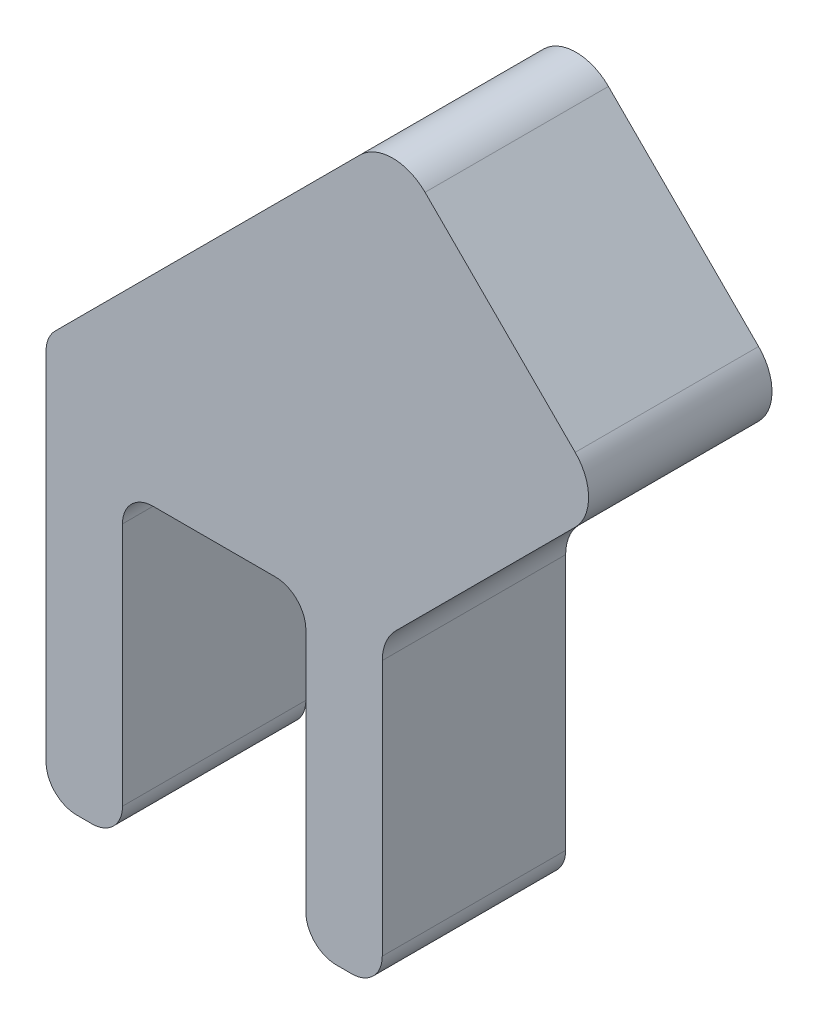
ISO-10303-21;
HEADER;
FILE_DESCRIPTION(('STEP AP214'),'2;1');
FILE_NAME('part.step','',(''),(''),'','','');
FILE_SCHEMA(('AUTOMOTIVE_DESIGN { 1 0 10303 214 1 1 1 1 }'));
ENDSEC;
DATA;
#1=APPLICATION_CONTEXT('core data for automotive mechanical design processes');
#2=APPLICATION_PROTOCOL_DEFINITION('international standard','automotive_design',2000,#1);
#3=PRODUCT_CONTEXT('',#1,'mechanical');
#4=PRODUCT('Part','Part','',(#3));
#5=PRODUCT_RELATED_PRODUCT_CATEGORY('part','',(#4));
#6=PRODUCT_DEFINITION_FORMATION('','',#4);
#7=PRODUCT_DEFINITION_CONTEXT('part definition',#1,'design');
#8=PRODUCT_DEFINITION('design','',#6,#7);
#9=PRODUCT_DEFINITION_SHAPE('','',#8);
#10=(LENGTH_UNIT() NAMED_UNIT(*) SI_UNIT(.MILLI.,.METRE.));
#11=(NAMED_UNIT(*) PLANE_ANGLE_UNIT() SI_UNIT($,.RADIAN.));
#12=(NAMED_UNIT(*) SI_UNIT($,.STERADIAN.) SOLID_ANGLE_UNIT());
#13=UNCERTAINTY_MEASURE_WITH_UNIT(LENGTH_MEASURE(1.E-05),#10,'distance_accuracy_value','');
#14=(GEOMETRIC_REPRESENTATION_CONTEXT(3) GLOBAL_UNCERTAINTY_ASSIGNED_CONTEXT((#13)) GLOBAL_UNIT_ASSIGNED_CONTEXT((#10,
#11,#12)) REPRESENTATION_CONTEXT('',''));
#15=CARTESIAN_POINT('',(0.,0.,0.));
#16=DIRECTION('',(0.,0.,1.));
#17=DIRECTION('',(1.,0.,0.));
#18=AXIS2_PLACEMENT_3D('',#15,#16,#17);
#19=CARTESIAN_POINT('',(0.,0.,12.));
#20=DIRECTION('',(1.,0.,0.));
#21=DIRECTION('',(0.,0.,-1.));
#22=AXIS2_PLACEMENT_3D('',#19,#20,#21);
#23=PLANE('',#22);
#24=DIRECTION('',(0.,-1.,0.));
#25=VECTOR('',#24,1.);
#26=CARTESIAN_POINT('',(0.,0.,12.));
#27=LINE('',#26,#25);
#28=CARTESIAN_POINT('',(0.,25.3071660955928,12.));
#29=VERTEX_POINT('',#28);
#30=CARTESIAN_POINT('',(0.,2.,12.));
#31=VERTEX_POINT('',#30);
#32=EDGE_CURVE('E238',#29,#31,#27,.T.);
#33=ORIENTED_EDGE('',*,*,#32,.F.);
#34=DIRECTION('',(0.,0.,-1.));
#35=VECTOR('',#34,1.);
#36=CARTESIAN_POINT('',(0.,25.3071660955928,12.));
#37=LINE('',#36,#35);
#38=CARTESIAN_POINT('',(0.,25.3071660955928,0.));
#39=VERTEX_POINT('',#38);
#40=EDGE_CURVE('E252',#29,#39,#37,.T.);
#41=ORIENTED_EDGE('',*,*,#40,.T.);
#42=DIRECTION('',(0.,-1.,0.));
#43=VECTOR('',#42,1.);
#44=CARTESIAN_POINT('',(0.,0.,0.));
#45=LINE('',#44,#43);
#46=CARTESIAN_POINT('',(0.,2.,0.));
#47=VERTEX_POINT('',#46);
#48=EDGE_CURVE('E207',#39,#47,#45,.T.);
#49=ORIENTED_EDGE('',*,*,#48,.T.);
#50=DIRECTION('',(0.,0.,-1.));
#51=VECTOR('',#50,1.);
#52=CARTESIAN_POINT('',(0.,2.,12.));
#53=LINE('',#52,#51);
#54=EDGE_CURVE('E187',#47,#31,#53,.F.);
#55=ORIENTED_EDGE('',*,*,#54,.T.);
#56=EDGE_LOOP('',(#33,#41,#49,#55));
#57=FACE_BOUND('',#56,.T.);
#58=ADVANCED_FACE('F33',(#57),#23,.F.);
#59=CARTESIAN_POINT('',(0.,0.,12.));
#60=DIRECTION('',(0.,1.,0.));
#61=DIRECTION('',(0.,0.,1.));
#62=AXIS2_PLACEMENT_3D('',#59,#60,#61);
#63=PLANE('',#62);
#64=DIRECTION('',(1.,0.,0.));
#65=VECTOR('',#64,1.);
#66=CARTESIAN_POINT('',(0.,0.,12.));
#67=LINE('',#66,#65);
#68=CARTESIAN_POINT('',(2.,0.,12.));
#69=VERTEX_POINT('',#68);
#70=CARTESIAN_POINT('',(3.,0.,12.));
#71=VERTEX_POINT('',#70);
#72=EDGE_CURVE('E333',#69,#71,#67,.T.);
#73=ORIENTED_EDGE('',*,*,#72,.F.);
#74=DIRECTION('',(0.,0.,-1.));
#75=VECTOR('',#74,1.);
#76=CARTESIAN_POINT('',(2.,0.,12.));
#77=LINE('',#76,#75);
#78=CARTESIAN_POINT('',(2.,0.,0.));
#79=VERTEX_POINT('',#78);
#80=EDGE_CURVE('E278',#69,#79,#77,.T.);
#81=ORIENTED_EDGE('',*,*,#80,.T.);
#82=DIRECTION('',(1.,0.,0.));
#83=VECTOR('',#82,1.);
#84=CARTESIAN_POINT('',(0.,0.,0.));
#85=LINE('',#84,#83);
#86=CARTESIAN_POINT('',(3.,0.,0.));
#87=VERTEX_POINT('',#86);
#88=EDGE_CURVE('E210',#79,#87,#85,.T.);
#89=ORIENTED_EDGE('',*,*,#88,.T.);
#90=DIRECTION('',(0.,0.,-1.));
#91=VECTOR('',#90,1.);
#92=CARTESIAN_POINT('',(3.,0.,12.));
#93=LINE('',#92,#91);
#94=EDGE_CURVE('E276',#87,#71,#93,.F.);
#95=ORIENTED_EDGE('',*,*,#94,.T.);
#96=EDGE_LOOP('',(#73,#81,#89,#95));
#97=FACE_BOUND('',#96,.T.);
#98=ADVANCED_FACE('F349',(#97),#63,.F.);
#99=CARTESIAN_POINT('',(5.,0.,12.));
#100=DIRECTION('',(-1.,0.,0.));
#101=DIRECTION('',(0.,0.,1.));
#102=AXIS2_PLACEMENT_3D('',#99,#100,#101);
#103=PLANE('',#102);
#104=DIRECTION('',(0.,1.,0.));
#105=VECTOR('',#104,1.);
#106=CARTESIAN_POINT('',(5.,0.,12.));
#107=LINE('',#106,#105);
#108=CARTESIAN_POINT('',(5.,2.,12.));
#109=VERTEX_POINT('',#108);
#110=CARTESIAN_POINT('',(5.,18.,12.));
#111=VERTEX_POINT('',#110);
#112=EDGE_CURVE('E328',#109,#111,#107,.T.);
#113=ORIENTED_EDGE('',*,*,#112,.F.);
#114=DIRECTION('',(0.,0.,-1.));
#115=VECTOR('',#114,1.);
#116=CARTESIAN_POINT('',(5.,2.,12.));
#117=LINE('',#116,#115);
#118=CARTESIAN_POINT('',(5.,2.,0.));
#119=VERTEX_POINT('',#118);
#120=EDGE_CURVE('E283',#109,#119,#117,.T.);
#121=ORIENTED_EDGE('',*,*,#120,.T.);
#122=DIRECTION('',(0.,1.,0.));
#123=VECTOR('',#122,1.);
#124=CARTESIAN_POINT('',(5.,0.,0.));
#125=LINE('',#124,#123);
#126=CARTESIAN_POINT('',(5.,18.,0.));
#127=VERTEX_POINT('',#126);
#128=EDGE_CURVE('E213',#119,#127,#125,.T.);
#129=ORIENTED_EDGE('',*,*,#128,.T.);
#130=DIRECTION('',(0.,0.,-1.));
#131=VECTOR('',#130,1.);
#132=CARTESIAN_POINT('',(5.,18.,12.));
#133=LINE('',#132,#131);
#134=EDGE_CURVE('E281',#127,#111,#133,.F.);
#135=ORIENTED_EDGE('',*,*,#134,.T.);
#136=EDGE_LOOP('',(#113,#121,#129,#135));
#137=FACE_BOUND('',#136,.T.);
#138=ADVANCED_FACE('F358',(#137),#103,.F.);
#139=CARTESIAN_POINT('',(5.,20.,12.));
#140=DIRECTION('',(0.,1.,0.));
#141=DIRECTION('',(0.,0.,1.));
#142=AXIS2_PLACEMENT_3D('',#139,#140,#141);
#143=PLANE('',#142);
#144=DIRECTION('',(1.,0.,0.));
#145=VECTOR('',#144,1.);
#146=CARTESIAN_POINT('',(5.,20.,12.));
#147=LINE('',#146,#145);
#148=CARTESIAN_POINT('',(7.,20.,12.));
#149=VERTEX_POINT('',#148);
#150=CARTESIAN_POINT('',(15.,20.,12.));
#151=VERTEX_POINT('',#150);
#152=EDGE_CURVE('E323',#149,#151,#147,.T.);
#153=ORIENTED_EDGE('',*,*,#152,.F.);
#154=DIRECTION('',(0.,0.,-1.));
#155=VECTOR('',#154,1.);
#156=CARTESIAN_POINT('',(7.,20.,0.));
#157=LINE('',#156,#155);
#158=CARTESIAN_POINT('',(7.,20.,0.));
#159=VERTEX_POINT('',#158);
#160=EDGE_CURVE('E299',#149,#159,#157,.T.);
#161=ORIENTED_EDGE('',*,*,#160,.T.);
#162=DIRECTION('',(1.,0.,0.));
#163=VECTOR('',#162,1.);
#164=CARTESIAN_POINT('',(5.,20.,0.));
#165=LINE('',#164,#163);
#166=CARTESIAN_POINT('',(15.,20.,0.));
#167=VERTEX_POINT('',#166);
#168=EDGE_CURVE('E216',#159,#167,#165,.T.);
#169=ORIENTED_EDGE('',*,*,#168,.T.);
#170=DIRECTION('',(0.,0.,-1.));
#171=VECTOR('',#170,1.);
#172=CARTESIAN_POINT('',(15.,20.,12.));
#173=LINE('',#172,#171);
#174=EDGE_CURVE('E297',#167,#151,#173,.F.);
#175=ORIENTED_EDGE('',*,*,#174,.T.);
#176=EDGE_LOOP('',(#153,#161,#169,#175));
#177=FACE_BOUND('',#176,.T.);
#178=ADVANCED_FACE('F315',(#177),#143,.F.);
#179=CARTESIAN_POINT('',(17.,20.,12.));
#180=DIRECTION('',(1.,0.,0.));
#181=DIRECTION('',(0.,1.,0.));
#182=AXIS2_PLACEMENT_3D('',#179,#180,#181);
#183=PLANE('',#182);
#184=DIRECTION('',(0.,-1.,0.));
#185=VECTOR('',#184,1.);
#186=CARTESIAN_POINT('',(17.,20.,0.));
#187=LINE('',#186,#185);
#188=CARTESIAN_POINT('',(17.,18.,0.));
#189=VERTEX_POINT('',#188);
#190=CARTESIAN_POINT('',(17.,2.,0.));
#191=VERTEX_POINT('',#190);
#192=EDGE_CURVE('E219',#189,#191,#187,.T.);
#193=ORIENTED_EDGE('',*,*,#192,.T.);
#194=DIRECTION('',(0.,0.,-1.));
#195=VECTOR('',#194,1.);
#196=CARTESIAN_POINT('',(17.,2.,12.));
#197=LINE('',#196,#195);
#198=CARTESIAN_POINT('',(17.,2.,12.));
#199=VERTEX_POINT('',#198);
#200=EDGE_CURVE('E293',#191,#199,#197,.F.);
#201=ORIENTED_EDGE('',*,*,#200,.T.);
#202=DIRECTION('',(0.,-1.,0.));
#203=VECTOR('',#202,1.);
#204=CARTESIAN_POINT('',(17.,20.,12.));
#205=LINE('',#204,#203);
#206=CARTESIAN_POINT('',(17.,18.,12.));
#207=VERTEX_POINT('',#206);
#208=EDGE_CURVE('E321',#207,#199,#205,.T.);
#209=ORIENTED_EDGE('',*,*,#208,.F.);
#210=DIRECTION('',(0.,0.,-1.));
#211=VECTOR('',#210,1.);
#212=CARTESIAN_POINT('',(17.,18.,0.));
#213=LINE('',#212,#211);
#214=EDGE_CURVE('E290',#207,#189,#213,.T.);
#215=ORIENTED_EDGE('',*,*,#214,.T.);
#216=EDGE_LOOP('',(#193,#201,#209,#215));
#217=FACE_BOUND('',#216,.T.);
#218=ADVANCED_FACE('F325',(#217),#183,.F.);
#219=CARTESIAN_POINT('',(17.,0.,12.));
#220=DIRECTION('',(0.,1.,0.));
#221=DIRECTION('',(0.,0.,1.));
#222=AXIS2_PLACEMENT_3D('',#219,#220,#221);
#223=PLANE('',#222);
#224=DIRECTION('',(1.,0.,0.));
#225=VECTOR('',#224,1.);
#226=CARTESIAN_POINT('',(17.,0.,12.));
#227=LINE('',#226,#225);
#228=CARTESIAN_POINT('',(19.,0.,12.));
#229=VERTEX_POINT('',#228);
#230=CARTESIAN_POINT('',(20.,0.,12.));
#231=VERTEX_POINT('',#230);
#232=EDGE_CURVE('E178',#229,#231,#227,.T.);
#233=ORIENTED_EDGE('',*,*,#232,.F.);
#234=DIRECTION('',(0.,0.,-1.));
#235=VECTOR('',#234,1.);
#236=CARTESIAN_POINT('',(19.,0.,12.));
#237=LINE('',#236,#235);
#238=CARTESIAN_POINT('',(19.,0.,0.));
#239=VERTEX_POINT('',#238);
#240=EDGE_CURVE('E287',#229,#239,#237,.T.);
#241=ORIENTED_EDGE('',*,*,#240,.T.);
#242=DIRECTION('',(1.,0.,0.));
#243=VECTOR('',#242,1.);
#244=CARTESIAN_POINT('',(17.,0.,0.));
#245=LINE('',#244,#243);
#246=CARTESIAN_POINT('',(20.,0.,0.));
#247=VERTEX_POINT('',#246);
#248=EDGE_CURVE('E222',#239,#247,#245,.T.);
#249=ORIENTED_EDGE('',*,*,#248,.T.);
#250=DIRECTION('',(0.,0.,-1.));
#251=VECTOR('',#250,1.);
#252=CARTESIAN_POINT('',(20.,0.,12.));
#253=LINE('',#252,#251);
#254=EDGE_CURVE('E56',#247,#231,#253,.F.);
#255=ORIENTED_EDGE('',*,*,#254,.T.);
#256=EDGE_LOOP('',(#233,#241,#249,#255));
#257=FACE_BOUND('',#256,.T.);
#258=ADVANCED_FACE('F393',(#257),#223,.F.);
#259=CARTESIAN_POINT('',(22.,0.,12.));
#260=DIRECTION('',(-1.,0.,0.));
#261=DIRECTION('',(0.,0.,1.));
#262=AXIS2_PLACEMENT_3D('',#259,#260,#261);
#263=PLANE('',#262);
#264=DIRECTION('',(0.,1.,0.));
#265=VECTOR('',#264,1.);
#266=CARTESIAN_POINT('',(22.,0.,12.));
#267=LINE('',#266,#265);
#268=CARTESIAN_POINT('',(22.,2.,12.));
#269=VERTEX_POINT('',#268);
#270=CARTESIAN_POINT('',(22.,18.7573593128807,12.));
#271=VERTEX_POINT('',#270);
#272=EDGE_CURVE('E168',#269,#271,#267,.T.);
#273=ORIENTED_EDGE('',*,*,#272,.F.);
#274=DIRECTION('',(0.,0.,-1.));
#275=VECTOR('',#274,1.);
#276=CARTESIAN_POINT('',(22.,2.,12.));
#277=LINE('',#276,#275);
#278=CARTESIAN_POINT('',(22.,2.,0.));
#279=VERTEX_POINT('',#278);
#280=EDGE_CURVE('E295',#269,#279,#277,.T.);
#281=ORIENTED_EDGE('',*,*,#280,.T.);
#282=DIRECTION('',(0.,1.,0.));
#283=VECTOR('',#282,1.);
#284=CARTESIAN_POINT('',(22.,0.,0.));
#285=LINE('',#284,#283);
#286=CARTESIAN_POINT('',(22.,18.7573593128807,0.));
#287=VERTEX_POINT('',#286);
#288=EDGE_CURVE('E184',#279,#287,#285,.T.);
#289=ORIENTED_EDGE('',*,*,#288,.T.);
#290=DIRECTION('',(0.,0.,-1.));
#291=VECTOR('',#290,1.);
#292=CARTESIAN_POINT('',(22.,18.7573593128807,12.));
#293=LINE('',#292,#291);
#294=EDGE_CURVE('E181',#271,#287,#293,.T.);
#295=ORIENTED_EDGE('',*,*,#294,.F.);
#296=EDGE_LOOP('',(#273,#281,#289,#295));
#297=FACE_BOUND('',#296,.T.);
#298=ADVANCED_FACE('F182',(#297),#263,.F.);
#299=CARTESIAN_POINT('',(25.,18.7573593128807,12.));
#300=DIRECTION('',(0.,0.,-1.));
#301=DIRECTION('',(-1.,0.,0.));
#302=AXIS2_PLACEMENT_3D('',#299,#300,#301);
#303=CYLINDRICAL_SURFACE('',#302,3.);
#304=CARTESIAN_POINT('',(25.,18.7573593128807,0.));
#305=DIRECTION('',(0.,0.,-1.));
#306=DIRECTION('',(-1.,0.,0.));
#307=AXIS2_PLACEMENT_3D('',#304,#305,#306);
#308=CIRCLE('',#307,3.);
#309=CARTESIAN_POINT('',(22.8786796564404,20.8786796564404,0.));
#310=VERTEX_POINT('',#309);
#311=EDGE_CURVE('E225',#287,#310,#308,.T.);
#312=ORIENTED_EDGE('',*,*,#311,.T.);
#313=DIRECTION('',(0.,0.,-1.));
#314=VECTOR('',#313,1.);
#315=CARTESIAN_POINT('',(22.8786796564404,20.8786796564404,12.));
#316=LINE('',#315,#314);
#317=CARTESIAN_POINT('',(22.8786796564404,20.8786796564404,12.));
#318=VERTEX_POINT('',#317);
#319=EDGE_CURVE('E188',#318,#310,#316,.T.);
#320=ORIENTED_EDGE('',*,*,#319,.F.);
#321=CARTESIAN_POINT('',(25.,18.7573593128807,12.));
#322=DIRECTION('',(0.,0.,-1.));
#323=DIRECTION('',(-1.,0.,0.));
#324=AXIS2_PLACEMENT_3D('',#321,#322,#323);
#325=CIRCLE('',#324,3.);
#326=EDGE_CURVE('E173',#271,#318,#325,.T.);
#327=ORIENTED_EDGE('',*,*,#326,.F.);
#328=ORIENTED_EDGE('',*,*,#294,.T.);
#329=EDGE_LOOP('',(#312,#320,#327,#328));
#330=FACE_BOUND('',#329,.T.);
#331=ADVANCED_FACE('F190',(#330),#303,.F.);
#332=CARTESIAN_POINT('',(22.8786796564404,20.8786796564404,12.));
#333=DIRECTION('',(-0.707106781186549,0.707106781186546,0.));
#334=DIRECTION('',(-0.707106781186546,-0.707106781186549,0.));
#335=AXIS2_PLACEMENT_3D('',#332,#333,#334);
#336=PLANE('',#335);
#337=DIRECTION('',(0.707106781186546,0.707106781186549,0.));
#338=VECTOR('',#337,1.);
#339=CARTESIAN_POINT('',(22.8786796564404,20.8786796564404,0.));
#340=LINE('',#339,#338);
#341=CARTESIAN_POINT('',(34.6244423683047,32.6244423683047,0.));
#342=VERTEX_POINT('',#341);
#343=EDGE_CURVE('E227',#310,#342,#340,.T.);
#344=ORIENTED_EDGE('',*,*,#343,.T.);
#345=DIRECTION('',(0.,0.,-1.));
#346=VECTOR('',#345,1.);
#347=CARTESIAN_POINT('',(34.6244423683047,32.6244423683047,12.));
#348=LINE('',#347,#346);
#349=CARTESIAN_POINT('',(34.6244423683047,32.6244423683047,12.));
#350=VERTEX_POINT('',#349);
#351=EDGE_CURVE('E247',#350,#342,#348,.T.);
#352=ORIENTED_EDGE('',*,*,#351,.F.);
#353=DIRECTION('',(0.707106781186546,0.707106781186549,0.));
#354=VECTOR('',#353,1.);
#355=CARTESIAN_POINT('',(22.8786796564404,20.8786796564404,12.));
#356=LINE('',#355,#354);
#357=EDGE_CURVE('E193',#318,#350,#356,.T.);
#358=ORIENTED_EDGE('',*,*,#357,.F.);
#359=ORIENTED_EDGE('',*,*,#319,.T.);
#360=EDGE_LOOP('',(#344,#352,#358,#359));
#361=FACE_BOUND('',#360,.T.);
#362=ADVANCED_FACE('F398',(#361),#336,.F.);
#363=CARTESIAN_POINT('',(32.5031220247451,34.7457627118644,12.));
#364=DIRECTION('',(0.,0.,-1.));
#365=DIRECTION('',(-1.,0.,0.));
#366=AXIS2_PLACEMENT_3D('',#363,#364,#365);
#367=CYLINDRICAL_SURFACE('',#366,3.);
#368=CARTESIAN_POINT('',(32.5031220247451,34.7457627118644,0.));
#369=DIRECTION('',(0.,0.,1.));
#370=DIRECTION('',(1.,0.,0.));
#371=AXIS2_PLACEMENT_3D('',#368,#369,#370);
#372=CIRCLE('',#371,3.);
#373=CARTESIAN_POINT('',(34.6244423683047,36.8670830554241,0.));
#374=VERTEX_POINT('',#373);
#375=EDGE_CURVE('E229',#342,#374,#372,.T.);
#376=ORIENTED_EDGE('',*,*,#375,.T.);
#377=DIRECTION('',(0.,0.,-1.));
#378=VECTOR('',#377,1.);
#379=CARTESIAN_POINT('',(34.6244423683047,36.8670830554241,12.));
#380=LINE('',#379,#378);
#381=CARTESIAN_POINT('',(34.6244423683047,36.8670830554241,12.));
#382=VERTEX_POINT('',#381);
#383=EDGE_CURVE('E244',#382,#374,#380,.T.);
#384=ORIENTED_EDGE('',*,*,#383,.F.);
#385=CARTESIAN_POINT('',(32.5031220247451,34.7457627118644,12.));
#386=DIRECTION('',(0.,0.,1.));
#387=DIRECTION('',(1.,0.,0.));
#388=AXIS2_PLACEMENT_3D('',#385,#386,#387);
#389=CIRCLE('',#388,3.);
#390=EDGE_CURVE('E195',#350,#382,#389,.T.);
#391=ORIENTED_EDGE('',*,*,#390,.F.);
#392=ORIENTED_EDGE('',*,*,#351,.T.);
#393=EDGE_LOOP('',(#376,#384,#391,#392));
#394=FACE_BOUND('',#393,.T.);
#395=ADVANCED_FACE('F405',(#394),#367,.T.);
#396=CARTESIAN_POINT('',(34.6244423683047,36.8670830554241,12.));
#397=DIRECTION('',(-0.707106781186546,-0.707106781186548,0.));
#398=DIRECTION('',(0.707106781186549,-0.707106781186547,0.));
#399=AXIS2_PLACEMENT_3D('',#396,#397,#398);
#400=PLANE('',#399);
#401=DIRECTION('',(-0.707106781186549,0.707106781186547,0.));
#402=VECTOR('',#401,1.);
#403=CARTESIAN_POINT('',(34.6244423683047,36.8670830554241,0.));
#404=LINE('',#403,#402);
#405=CARTESIAN_POINT('',(24.7992864452545,46.6922389784743,0.));
#406=VERTEX_POINT('',#405);
#407=EDGE_CURVE('E231',#374,#406,#404,.T.);
#408=ORIENTED_EDGE('',*,*,#407,.T.);
#409=DIRECTION('',(0.,0.,-1.));
#410=VECTOR('',#409,1.);
#411=CARTESIAN_POINT('',(24.7992864452545,46.6922389784743,12.));
#412=LINE('',#411,#410);
#413=CARTESIAN_POINT('',(24.7992864452545,46.6922389784743,12.));
#414=VERTEX_POINT('',#413);
#415=EDGE_CURVE('E241',#414,#406,#412,.T.);
#416=ORIENTED_EDGE('',*,*,#415,.F.);
#417=DIRECTION('',(-0.707106781186549,0.707106781186547,0.));
#418=VECTOR('',#417,1.);
#419=CARTESIAN_POINT('',(34.6244423683047,36.8670830554241,12.));
#420=LINE('',#419,#418);
#421=EDGE_CURVE('E200',#382,#414,#420,.T.);
#422=ORIENTED_EDGE('',*,*,#421,.F.);
#423=ORIENTED_EDGE('',*,*,#383,.T.);
#424=EDGE_LOOP('',(#408,#416,#422,#423));
#425=FACE_BOUND('',#424,.T.);
#426=ADVANCED_FACE('F408',(#425),#400,.F.);
#427=CARTESIAN_POINT('',(22.6779661016948,44.5709186349146,12.));
#428=DIRECTION('',(0.,0.,-1.));
#429=DIRECTION('',(-1.,0.,0.));
#430=AXIS2_PLACEMENT_3D('',#427,#428,#429);
#431=CYLINDRICAL_SURFACE('',#430,3.);
#432=CARTESIAN_POINT('',(22.6779661016948,44.5709186349146,0.));
#433=DIRECTION('',(0.,0.,1.));
#434=DIRECTION('',(1.,0.,0.));
#435=AXIS2_PLACEMENT_3D('',#432,#433,#434);
#436=CIRCLE('',#435,3.);
#437=CARTESIAN_POINT('',(20.5566457581352,46.6922389784742,0.));
#438=VERTEX_POINT('',#437);
#439=EDGE_CURVE('E233',#406,#438,#436,.T.);
#440=ORIENTED_EDGE('',*,*,#439,.T.);
#441=DIRECTION('',(0.,0.,-1.));
#442=VECTOR('',#441,1.);
#443=CARTESIAN_POINT('',(20.5566457581352,46.6922389784742,12.));
#444=LINE('',#443,#442);
#445=CARTESIAN_POINT('',(20.5566457581352,46.6922389784742,12.));
#446=VERTEX_POINT('',#445);
#447=EDGE_CURVE('E206',#446,#438,#444,.T.);
#448=ORIENTED_EDGE('',*,*,#447,.F.);
#449=CARTESIAN_POINT('',(22.6779661016948,44.5709186349146,12.));
#450=DIRECTION('',(0.,0.,1.));
#451=DIRECTION('',(1.,0.,0.));
#452=AXIS2_PLACEMENT_3D('',#449,#450,#451);
#453=CIRCLE('',#452,3.);
#454=EDGE_CURVE('E202',#414,#446,#453,.T.);
#455=ORIENTED_EDGE('',*,*,#454,.F.);
#456=ORIENTED_EDGE('',*,*,#415,.T.);
#457=EDGE_LOOP('',(#440,#448,#455,#456));
#458=FACE_BOUND('',#457,.T.);
#459=ADVANCED_FACE('F413',(#458),#431,.T.);
#460=CARTESIAN_POINT('',(0.,26.135593220339,12.));
#461=DIRECTION('',(0.707106781186549,-0.707106781186546,0.));
#462=DIRECTION('',(0.707106781186546,0.707106781186549,0.));
#463=AXIS2_PLACEMENT_3D('',#460,#461,#462);
#464=PLANE('',#463);
#465=DIRECTION('',(-0.707106781186546,-0.707106781186549,0.));
#466=VECTOR('',#465,1.);
#467=CARTESIAN_POINT('',(0.,26.135593220339,0.));
#468=LINE('',#467,#466);
#469=CARTESIAN_POINT('',(0.585786437626902,26.7213796579659,0.));
#470=VERTEX_POINT('',#469);
#471=EDGE_CURVE('E235',#438,#470,#468,.T.);
#472=ORIENTED_EDGE('',*,*,#471,.T.);
#473=DIRECTION('',(0.,0.,-1.));
#474=VECTOR('',#473,1.);
#475=CARTESIAN_POINT('',(0.585786437626902,26.7213796579659,12.));
#476=LINE('',#475,#474);
#477=CARTESIAN_POINT('',(0.585786437626902,26.7213796579659,12.));
#478=VERTEX_POINT('',#477);
#479=EDGE_CURVE('E265',#470,#478,#476,.F.);
#480=ORIENTED_EDGE('',*,*,#479,.T.);
#481=DIRECTION('',(-0.707106781186546,-0.707106781186549,0.));
#482=VECTOR('',#481,1.);
#483=CARTESIAN_POINT('',(0.,26.135593220339,12.));
#484=LINE('',#483,#482);
#485=EDGE_CURVE('E204',#446,#478,#484,.T.);
#486=ORIENTED_EDGE('',*,*,#485,.F.);
#487=ORIENTED_EDGE('',*,*,#447,.T.);
#488=EDGE_LOOP('',(#472,#480,#486,#487));
#489=FACE_BOUND('',#488,.T.);
#490=ADVANCED_FACE('F418',(#489),#464,.F.);
#491=CARTESIAN_POINT('',(22.6779661016948,44.5709186349146,12.));
#492=DIRECTION('',(0.,0.,1.));
#493=DIRECTION('',(1.,0.,0.));
#494=AXIS2_PLACEMENT_3D('',#491,#492,#493);
#495=PLANE('',#494);
#496=ORIENTED_EDGE('',*,*,#485,.T.);
#497=CARTESIAN_POINT('',(2.,25.3071660955928,12.));
#498=DIRECTION('',(0.,0.,1.));
#499=DIRECTION('',(1.,0.,0.));
#500=AXIS2_PLACEMENT_3D('',#497,#498,#499);
#501=CIRCLE('',#500,2.);
#502=EDGE_CURVE('E274',#478,#29,#501,.T.);
#503=ORIENTED_EDGE('',*,*,#502,.T.);
#504=ORIENTED_EDGE('',*,*,#32,.T.);
#505=CARTESIAN_POINT('',(2.,2.,12.));
#506=DIRECTION('',(0.,0.,1.));
#507=DIRECTION('',(1.,0.,0.));
#508=AXIS2_PLACEMENT_3D('',#505,#506,#507);
#509=CIRCLE('',#508,2.);
#510=EDGE_CURVE('E272',#31,#69,#509,.T.);
#511=ORIENTED_EDGE('',*,*,#510,.T.);
#512=ORIENTED_EDGE('',*,*,#72,.T.);
#513=CARTESIAN_POINT('',(3.,2.,12.));
#514=DIRECTION('',(0.,0.,1.));
#515=DIRECTION('',(1.,0.,0.));
#516=AXIS2_PLACEMENT_3D('',#513,#514,#515);
#517=CIRCLE('',#516,2.);
#518=EDGE_CURVE('E270',#71,#109,#517,.T.);
#519=ORIENTED_EDGE('',*,*,#518,.T.);
#520=ORIENTED_EDGE('',*,*,#112,.T.);
#521=CARTESIAN_POINT('',(7.,18.,12.));
#522=DIRECTION('',(0.,0.,1.));
#523=DIRECTION('',(1.,0.,0.));
#524=AXIS2_PLACEMENT_3D('',#521,#522,#523);
#525=CIRCLE('',#524,2.);
#526=EDGE_CURVE('E304',#111,#149,#525,.F.);
#527=ORIENTED_EDGE('',*,*,#526,.T.);
#528=ORIENTED_EDGE('',*,*,#152,.T.);
#529=CARTESIAN_POINT('',(15.,18.,12.));
#530=DIRECTION('',(0.,0.,1.));
#531=DIRECTION('',(1.,0.,0.));
#532=AXIS2_PLACEMENT_3D('',#529,#530,#531);
#533=CIRCLE('',#532,2.);
#534=EDGE_CURVE('E11',#151,#207,#533,.F.);
#535=ORIENTED_EDGE('',*,*,#534,.T.);
#536=ORIENTED_EDGE('',*,*,#208,.T.);
#537=CARTESIAN_POINT('',(19.,2.,12.));
#538=DIRECTION('',(0.,0.,1.));
#539=DIRECTION('',(1.,0.,0.));
#540=AXIS2_PLACEMENT_3D('',#537,#538,#539);
#541=CIRCLE('',#540,2.);
#542=EDGE_CURVE('E268',#199,#229,#541,.T.);
#543=ORIENTED_EDGE('',*,*,#542,.T.);
#544=ORIENTED_EDGE('',*,*,#232,.T.);
#545=CARTESIAN_POINT('',(20.,2.,12.));
#546=DIRECTION('',(0.,0.,1.));
#547=DIRECTION('',(1.,0.,0.));
#548=AXIS2_PLACEMENT_3D('',#545,#546,#547);
#549=CIRCLE('',#548,2.);
#550=EDGE_CURVE('E48',#231,#269,#549,.T.);
#551=ORIENTED_EDGE('',*,*,#550,.T.);
#552=ORIENTED_EDGE('',*,*,#272,.T.);
#553=ORIENTED_EDGE('',*,*,#326,.T.);
#554=ORIENTED_EDGE('',*,*,#357,.T.);
#555=ORIENTED_EDGE('',*,*,#390,.T.);
#556=ORIENTED_EDGE('',*,*,#421,.T.);
#557=ORIENTED_EDGE('',*,*,#454,.T.);
#558=EDGE_LOOP('',(#496,#503,#504,#511,#512,#519,#520,#527,#528,#535,#536,#543,#544,#551,#552,
#553,#554,#555,#556,#557));
#559=FACE_BOUND('',#558,.T.);
#560=ADVANCED_FACE('F171',(#559),#495,.T.);
#561=CARTESIAN_POINT('',(22.6779661016948,44.5709186349146,0.));
#562=DIRECTION('',(0.,0.,1.));
#563=DIRECTION('',(1.,0.,0.));
#564=AXIS2_PLACEMENT_3D('',#561,#562,#563);
#565=PLANE('',#564);
#566=ORIENTED_EDGE('',*,*,#48,.F.);
#567=CARTESIAN_POINT('',(2.,25.3071660955928,0.));
#568=DIRECTION('',(0.,0.,1.));
#569=DIRECTION('',(1.,0.,0.));
#570=AXIS2_PLACEMENT_3D('',#567,#568,#569);
#571=CIRCLE('',#570,2.);
#572=EDGE_CURVE('E263',#39,#470,#571,.F.);
#573=ORIENTED_EDGE('',*,*,#572,.T.);
#574=ORIENTED_EDGE('',*,*,#471,.F.);
#575=ORIENTED_EDGE('',*,*,#439,.F.);
#576=ORIENTED_EDGE('',*,*,#407,.F.);
#577=ORIENTED_EDGE('',*,*,#375,.F.);
#578=ORIENTED_EDGE('',*,*,#343,.F.);
#579=ORIENTED_EDGE('',*,*,#311,.F.);
#580=ORIENTED_EDGE('',*,*,#288,.F.);
#581=CARTESIAN_POINT('',(20.,2.,0.));
#582=DIRECTION('',(0.,0.,1.));
#583=DIRECTION('',(1.,0.,0.));
#584=AXIS2_PLACEMENT_3D('',#581,#582,#583);
#585=CIRCLE('',#584,2.);
#586=EDGE_CURVE('E255',#279,#247,#585,.F.);
#587=ORIENTED_EDGE('',*,*,#586,.T.);
#588=ORIENTED_EDGE('',*,*,#248,.F.);
#589=CARTESIAN_POINT('',(19.,2.,0.));
#590=DIRECTION('',(0.,0.,1.));
#591=DIRECTION('',(1.,0.,0.));
#592=AXIS2_PLACEMENT_3D('',#589,#590,#591);
#593=CIRCLE('',#592,2.);
#594=EDGE_CURVE('E257',#239,#191,#593,.F.);
#595=ORIENTED_EDGE('',*,*,#594,.T.);
#596=ORIENTED_EDGE('',*,*,#192,.F.);
#597=CARTESIAN_POINT('',(15.,18.,0.));
#598=DIRECTION('',(0.,0.,1.));
#599=DIRECTION('',(1.,0.,0.));
#600=AXIS2_PLACEMENT_3D('',#597,#598,#599);
#601=CIRCLE('',#600,2.);
#602=EDGE_CURVE('E41',#189,#167,#601,.T.);
#603=ORIENTED_EDGE('',*,*,#602,.T.);
#604=ORIENTED_EDGE('',*,*,#168,.F.);
#605=CARTESIAN_POINT('',(7.,18.,0.));
#606=DIRECTION('',(0.,0.,1.));
#607=DIRECTION('',(1.,0.,0.));
#608=AXIS2_PLACEMENT_3D('',#605,#606,#607);
#609=CIRCLE('',#608,2.);
#610=EDGE_CURVE('E302',#159,#127,#609,.T.);
#611=ORIENTED_EDGE('',*,*,#610,.T.);
#612=ORIENTED_EDGE('',*,*,#128,.F.);
#613=CARTESIAN_POINT('',(3.,2.,0.));
#614=DIRECTION('',(0.,0.,1.));
#615=DIRECTION('',(1.,0.,0.));
#616=AXIS2_PLACEMENT_3D('',#613,#614,#615);
#617=CIRCLE('',#616,2.);
#618=EDGE_CURVE('E259',#119,#87,#617,.F.);
#619=ORIENTED_EDGE('',*,*,#618,.T.);
#620=ORIENTED_EDGE('',*,*,#88,.F.);
#621=CARTESIAN_POINT('',(2.,2.,0.));
#622=DIRECTION('',(0.,0.,1.));
#623=DIRECTION('',(1.,0.,0.));
#624=AXIS2_PLACEMENT_3D('',#621,#622,#623);
#625=CIRCLE('',#624,2.);
#626=EDGE_CURVE('E261',#79,#47,#625,.F.);
#627=ORIENTED_EDGE('',*,*,#626,.T.);
#628=EDGE_LOOP('',(#566,#573,#574,#575,#576,#577,#578,#579,#580,#587,#588,#595,#596,#603,#604,
#611,#612,#619,#620,#627));
#629=FACE_BOUND('',#628,.T.);
#630=ADVANCED_FACE('F309',(#629),#565,.F.);
#631=CARTESIAN_POINT('',(2.,25.3071660955928,12.));
#632=DIRECTION('',(0.,0.,-1.));
#633=DIRECTION('',(-1.,0.,0.));
#634=AXIS2_PLACEMENT_3D('',#631,#632,#633);
#635=CYLINDRICAL_SURFACE('',#634,2.);
#636=ORIENTED_EDGE('',*,*,#502,.F.);
#637=ORIENTED_EDGE('',*,*,#479,.F.);
#638=ORIENTED_EDGE('',*,*,#572,.F.);
#639=ORIENTED_EDGE('',*,*,#40,.F.);
#640=EDGE_LOOP('',(#636,#637,#638,#639));
#641=FACE_BOUND('',#640,.T.);
#642=ADVANCED_FACE('F380',(#641),#635,.T.);
#643=CARTESIAN_POINT('',(2.,2.,12.));
#644=DIRECTION('',(0.,0.,-1.));
#645=DIRECTION('',(-1.,0.,0.));
#646=AXIS2_PLACEMENT_3D('',#643,#644,#645);
#647=CYLINDRICAL_SURFACE('',#646,2.);
#648=ORIENTED_EDGE('',*,*,#510,.F.);
#649=ORIENTED_EDGE('',*,*,#54,.F.);
#650=ORIENTED_EDGE('',*,*,#626,.F.);
#651=ORIENTED_EDGE('',*,*,#80,.F.);
#652=EDGE_LOOP('',(#648,#649,#650,#651));
#653=FACE_BOUND('',#652,.T.);
#654=ADVANCED_FACE('F346',(#653),#647,.T.);
#655=CARTESIAN_POINT('',(3.,2.,12.));
#656=DIRECTION('',(0.,0.,-1.));
#657=DIRECTION('',(-1.,0.,0.));
#658=AXIS2_PLACEMENT_3D('',#655,#656,#657);
#659=CYLINDRICAL_SURFACE('',#658,2.);
#660=ORIENTED_EDGE('',*,*,#518,.F.);
#661=ORIENTED_EDGE('',*,*,#94,.F.);
#662=ORIENTED_EDGE('',*,*,#618,.F.);
#663=ORIENTED_EDGE('',*,*,#120,.F.);
#664=EDGE_LOOP('',(#660,#661,#662,#663));
#665=FACE_BOUND('',#664,.T.);
#666=ADVANCED_FACE('F355',(#665),#659,.T.);
#667=CARTESIAN_POINT('',(19.,2.,12.));
#668=DIRECTION('',(0.,0.,-1.));
#669=DIRECTION('',(-1.,0.,0.));
#670=AXIS2_PLACEMENT_3D('',#667,#668,#669);
#671=CYLINDRICAL_SURFACE('',#670,2.);
#672=ORIENTED_EDGE('',*,*,#542,.F.);
#673=ORIENTED_EDGE('',*,*,#200,.F.);
#674=ORIENTED_EDGE('',*,*,#594,.F.);
#675=ORIENTED_EDGE('',*,*,#240,.F.);
#676=EDGE_LOOP('',(#672,#673,#674,#675));
#677=FACE_BOUND('',#676,.T.);
#678=ADVANCED_FACE('F369',(#677),#671,.T.);
#679=CARTESIAN_POINT('',(20.,2.,12.));
#680=DIRECTION('',(0.,0.,-1.));
#681=DIRECTION('',(-1.,0.,0.));
#682=AXIS2_PLACEMENT_3D('',#679,#680,#681);
#683=CYLINDRICAL_SURFACE('',#682,2.);
#684=ORIENTED_EDGE('',*,*,#550,.F.);
#685=ORIENTED_EDGE('',*,*,#254,.F.);
#686=ORIENTED_EDGE('',*,*,#586,.F.);
#687=ORIENTED_EDGE('',*,*,#280,.F.);
#688=EDGE_LOOP('',(#684,#685,#686,#687));
#689=FACE_BOUND('',#688,.T.);
#690=ADVANCED_FACE('F364',(#689),#683,.T.);
#691=CARTESIAN_POINT('',(7.,18.,12.));
#692=DIRECTION('',(0.,0.,1.));
#693=DIRECTION('',(1.,0.,0.));
#694=AXIS2_PLACEMENT_3D('',#691,#692,#693);
#695=CYLINDRICAL_SURFACE('',#694,2.);
#696=ORIENTED_EDGE('',*,*,#526,.F.);
#697=ORIENTED_EDGE('',*,*,#134,.F.);
#698=ORIENTED_EDGE('',*,*,#610,.F.);
#699=ORIENTED_EDGE('',*,*,#160,.F.);
#700=EDGE_LOOP('',(#696,#697,#698,#699));
#701=FACE_BOUND('',#700,.T.);
#702=ADVANCED_FACE('F362',(#701),#695,.F.);
#703=CARTESIAN_POINT('',(15.,18.,12.));
#704=DIRECTION('',(0.,0.,1.));
#705=DIRECTION('',(1.,0.,0.));
#706=AXIS2_PLACEMENT_3D('',#703,#704,#705);
#707=CYLINDRICAL_SURFACE('',#706,2.);
#708=ORIENTED_EDGE('',*,*,#534,.F.);
#709=ORIENTED_EDGE('',*,*,#174,.F.);
#710=ORIENTED_EDGE('',*,*,#602,.F.);
#711=ORIENTED_EDGE('',*,*,#214,.F.);
#712=EDGE_LOOP('',(#708,#709,#710,#711));
#713=FACE_BOUND('',#712,.T.);
#714=ADVANCED_FACE('F35',(#713),#707,.F.);
#715=CLOSED_SHELL('',(#58,#98,#138,#178,#218,#258,#298,#331,#362,#395,#426,#459,#490,#560,#630,
#642,#654,#666,#678,#690,#702,#714));
#716=MANIFOLD_SOLID_BREP('B2',#715);
#717=ADVANCED_BREP_SHAPE_REPRESENTATION('',(#18,#716),#14);
#718=SHAPE_DEFINITION_REPRESENTATION(#9,#717);
ENDSEC;
END-ISO-10303-21;
